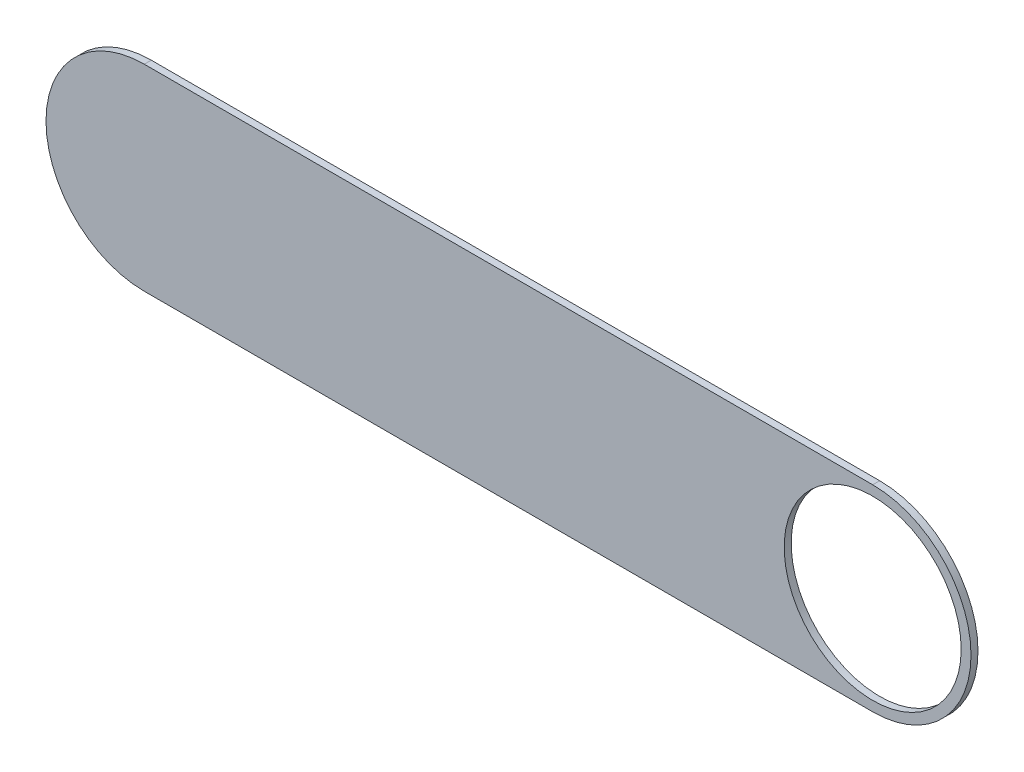
ISO-10303-21;
HEADER;
FILE_DESCRIPTION(('STEP AP214'),'2;1');
FILE_NAME('part.step','',(''),(''),'','','');
FILE_SCHEMA(('AUTOMOTIVE_DESIGN { 1 0 10303 214 1 1 1 1 }'));
ENDSEC;
DATA;
#1=APPLICATION_CONTEXT('core data for automotive mechanical design processes');
#2=APPLICATION_PROTOCOL_DEFINITION('international standard','automotive_design',2000,#1);
#3=PRODUCT_CONTEXT('',#1,'mechanical');
#4=PRODUCT('Part','Part','',(#3));
#5=PRODUCT_RELATED_PRODUCT_CATEGORY('part','',(#4));
#6=PRODUCT_DEFINITION_FORMATION('','',#4);
#7=PRODUCT_DEFINITION_CONTEXT('part definition',#1,'design');
#8=PRODUCT_DEFINITION('design','',#6,#7);
#9=PRODUCT_DEFINITION_SHAPE('','',#8);
#10=(LENGTH_UNIT() NAMED_UNIT(*) SI_UNIT(.MILLI.,.METRE.));
#11=(NAMED_UNIT(*) PLANE_ANGLE_UNIT() SI_UNIT($,.RADIAN.));
#12=(NAMED_UNIT(*) SI_UNIT($,.STERADIAN.) SOLID_ANGLE_UNIT());
#13=UNCERTAINTY_MEASURE_WITH_UNIT(LENGTH_MEASURE(1.E-05),#10,'distance_accuracy_value','');
#14=(GEOMETRIC_REPRESENTATION_CONTEXT(3) GLOBAL_UNCERTAINTY_ASSIGNED_CONTEXT((#13)) GLOBAL_UNIT_ASSIGNED_CONTEXT((#10,
#11,#12)) REPRESENTATION_CONTEXT('',''));
#15=CARTESIAN_POINT('',(0.,0.,0.));
#16=DIRECTION('',(0.,0.,1.));
#17=DIRECTION('',(1.,0.,0.));
#18=AXIS2_PLACEMENT_3D('',#15,#16,#17);
#19=CARTESIAN_POINT('',(113.4961916,51.9599926,0.));
#20=DIRECTION('',(0.,1.,0.));
#21=DIRECTION('',(1.,0.,0.));
#22=AXIS2_PLACEMENT_3D('',#19,#20,#21);
#23=PLANE('',#22);
#24=DIRECTION('',(1.,0.,0.));
#25=VECTOR('',#24,1.);
#26=CARTESIAN_POINT('',(113.4961916,51.9599926,0.03556));
#27=LINE('',#26,#25);
#28=CARTESIAN_POINT('',(113.4961916,51.9599926,0.03556));
#29=VERTEX_POINT('',#28);
#30=CARTESIAN_POINT('',(117.2000196,51.9599926,0.03556));
#31=VERTEX_POINT('',#30);
#32=EDGE_CURVE('E11',#29,#31,#27,.T.);
#33=ORIENTED_EDGE('',*,*,#32,.F.);
#34=DIRECTION('',(0.,0.,1.));
#35=VECTOR('',#34,1.);
#36=CARTESIAN_POINT('',(113.4961916,51.9599926,0.));
#37=LINE('',#36,#35);
#38=CARTESIAN_POINT('',(113.4961916,51.9599926,0.));
#39=VERTEX_POINT('',#38);
#40=EDGE_CURVE('E24',#39,#29,#37,.T.);
#41=ORIENTED_EDGE('',*,*,#40,.F.);
#42=DIRECTION('',(1.,0.,0.));
#43=VECTOR('',#42,1.);
#44=CARTESIAN_POINT('',(113.4961916,51.9599926,0.));
#45=LINE('',#44,#43);
#46=CARTESIAN_POINT('',(117.2000196,51.9599926,0.));
#47=VERTEX_POINT('',#46);
#48=EDGE_CURVE('E96',#39,#47,#45,.T.);
#49=ORIENTED_EDGE('',*,*,#48,.T.);
#50=DIRECTION('',(0.,0.,1.));
#51=VECTOR('',#50,1.);
#52=CARTESIAN_POINT('',(117.2000196,51.9599926,0.));
#53=LINE('',#52,#51);
#54=EDGE_CURVE('E37',#47,#31,#53,.T.);
#55=ORIENTED_EDGE('',*,*,#54,.T.);
#56=EDGE_LOOP('',(#33,#41,#49,#55));
#57=FACE_BOUND('',#56,.T.);
#58=ADVANCED_FACE('F17',(#57),#23,.F.);
#59=CARTESIAN_POINT('',(113.4961916,52.4599916,0.));
#60=DIRECTION('',(0.,0.,-1.));
#61=DIRECTION('',(0.,1.,0.));
#62=AXIS2_PLACEMENT_3D('',#59,#60,#61);
#63=CYLINDRICAL_SURFACE('',#62,0.499999);
#64=CARTESIAN_POINT('',(113.4961916,52.4599916,0.03556));
#65=DIRECTION('',(0.,0.,1.));
#66=DIRECTION('',(0.,1.,0.));
#67=AXIS2_PLACEMENT_3D('',#64,#65,#66);
#68=CIRCLE('',#67,0.499999);
#69=CARTESIAN_POINT('',(113.4961916,52.9599906,0.03556));
#70=VERTEX_POINT('',#69);
#71=EDGE_CURVE('E92',#70,#29,#68,.T.);
#72=ORIENTED_EDGE('',*,*,#71,.F.);
#73=DIRECTION('',(0.,0.,1.));
#74=VECTOR('',#73,1.);
#75=CARTESIAN_POINT('',(113.4961916,52.9599906,0.));
#76=LINE('',#75,#74);
#77=CARTESIAN_POINT('',(113.4961916,52.9599906,0.));
#78=VERTEX_POINT('',#77);
#79=EDGE_CURVE('E90',#78,#70,#76,.T.);
#80=ORIENTED_EDGE('',*,*,#79,.F.);
#81=CARTESIAN_POINT('',(113.4961916,52.4599916,0.));
#82=DIRECTION('',(0.,0.,1.));
#83=DIRECTION('',(0.,1.,0.));
#84=AXIS2_PLACEMENT_3D('',#81,#82,#83);
#85=CIRCLE('',#84,0.499999);
#86=EDGE_CURVE('E88',#78,#39,#85,.T.);
#87=ORIENTED_EDGE('',*,*,#86,.T.);
#88=ORIENTED_EDGE('',*,*,#40,.T.);
#89=EDGE_LOOP('',(#72,#80,#87,#88));
#90=FACE_BOUND('',#89,.T.);
#91=ADVANCED_FACE('F111',(#90),#63,.T.);
#92=CARTESIAN_POINT('',(117.2000196,52.4599916,0.));
#93=DIRECTION('',(0.,0.,-1.));
#94=DIRECTION('',(0.,-1.,0.));
#95=AXIS2_PLACEMENT_3D('',#92,#93,#94);
#96=CYLINDRICAL_SURFACE('',#95,0.499999);
#97=CARTESIAN_POINT('',(117.2000196,52.4599916,0.03556));
#98=DIRECTION('',(0.,0.,1.));
#99=DIRECTION('',(0.,-1.,0.));
#100=AXIS2_PLACEMENT_3D('',#97,#98,#99);
#101=CIRCLE('',#100,0.499999);
#102=CARTESIAN_POINT('',(117.2000196,52.9599906,0.03556));
#103=VERTEX_POINT('',#102);
#104=EDGE_CURVE('E85',#31,#103,#101,.T.);
#105=ORIENTED_EDGE('',*,*,#104,.F.);
#106=ORIENTED_EDGE('',*,*,#54,.F.);
#107=CARTESIAN_POINT('',(117.2000196,52.4599916,0.));
#108=DIRECTION('',(0.,0.,1.));
#109=DIRECTION('',(0.,-1.,0.));
#110=AXIS2_PLACEMENT_3D('',#107,#108,#109);
#111=CIRCLE('',#110,0.499999);
#112=CARTESIAN_POINT('',(117.2000196,52.9599906,0.));
#113=VERTEX_POINT('',#112);
#114=EDGE_CURVE('E82',#47,#113,#111,.T.);
#115=ORIENTED_EDGE('',*,*,#114,.T.);
#116=DIRECTION('',(0.,0.,1.));
#117=VECTOR('',#116,1.);
#118=CARTESIAN_POINT('',(117.2000196,52.9599906,0.));
#119=LINE('',#118,#117);
#120=EDGE_CURVE('E80',#113,#103,#119,.T.);
#121=ORIENTED_EDGE('',*,*,#120,.T.);
#122=EDGE_LOOP('',(#105,#106,#115,#121));
#123=FACE_BOUND('',#122,.T.);
#124=ADVANCED_FACE('F104',(#123),#96,.T.);
#125=CARTESIAN_POINT('',(117.2000196,52.9599906,0.));
#126=DIRECTION('',(0.,-1.,0.));
#127=DIRECTION('',(-1.,0.,0.));
#128=AXIS2_PLACEMENT_3D('',#125,#126,#127);
#129=PLANE('',#128);
#130=DIRECTION('',(-1.,0.,0.));
#131=VECTOR('',#130,1.);
#132=CARTESIAN_POINT('',(117.2000196,52.9599906,0.03556));
#133=LINE('',#132,#131);
#134=EDGE_CURVE('E77',#103,#70,#133,.T.);
#135=ORIENTED_EDGE('',*,*,#134,.F.);
#136=ORIENTED_EDGE('',*,*,#120,.F.);
#137=DIRECTION('',(-1.,0.,0.));
#138=VECTOR('',#137,1.);
#139=CARTESIAN_POINT('',(117.2000196,52.9599906,0.));
#140=LINE('',#139,#138);
#141=EDGE_CURVE('E68',#113,#78,#140,.T.);
#142=ORIENTED_EDGE('',*,*,#141,.T.);
#143=ORIENTED_EDGE('',*,*,#79,.T.);
#144=EDGE_LOOP('',(#135,#136,#142,#143));
#145=FACE_BOUND('',#144,.T.);
#146=ADVANCED_FACE('F110',(#145),#129,.F.);
#147=CARTESIAN_POINT('',(117.2000196,52.4599916,0.));
#148=DIRECTION('',(0.,0.,-1.));
#149=DIRECTION('',(1.,0.,0.));
#150=AXIS2_PLACEMENT_3D('',#147,#148,#149);
#151=CYLINDRICAL_SURFACE('',#150,0.4499991);
#152=DIRECTION('',(0.,0.,1.));
#153=VECTOR('',#152,1.);
#154=CARTESIAN_POINT('',(117.6500187,52.4599916,0.));
#155=LINE('',#154,#153);
#156=CARTESIAN_POINT('',(117.6500187,52.4599916,0.));
#157=VERTEX_POINT('',#156);
#158=CARTESIAN_POINT('',(117.6500187,52.4599916,0.03556));
#159=VERTEX_POINT('',#158);
#160=EDGE_CURVE('E62',#157,#159,#155,.T.);
#161=ORIENTED_EDGE('',*,*,#160,.T.);
#162=CARTESIAN_POINT('',(117.2000196,52.4599916,0.03556));
#163=DIRECTION('',(0.,0.,1.));
#164=DIRECTION('',(1.,0.,0.));
#165=AXIS2_PLACEMENT_3D('',#162,#163,#164);
#166=CIRCLE('',#165,0.4499991);
#167=EDGE_CURVE('E67',#159,#159,#166,.T.);
#168=ORIENTED_EDGE('',*,*,#167,.T.);
#169=ORIENTED_EDGE('',*,*,#160,.F.);
#170=CARTESIAN_POINT('',(117.2000196,52.4599916,0.));
#171=DIRECTION('',(0.,0.,1.));
#172=DIRECTION('',(1.,0.,0.));
#173=AXIS2_PLACEMENT_3D('',#170,#171,#172);
#174=CIRCLE('',#173,0.4499991);
#175=EDGE_CURVE('E65',#157,#157,#174,.T.);
#176=ORIENTED_EDGE('',*,*,#175,.F.);
#177=EDGE_LOOP('',(#161,#168,#169,#176));
#178=FACE_BOUND('',#177,.T.);
#179=ADVANCED_FACE('F64',(#178),#151,.F.);
#180=CARTESIAN_POINT('',(113.4961916,51.9599926,0.));
#181=DIRECTION('',(0.,0.,-1.));
#182=DIRECTION('',(-1.,0.,0.));
#183=AXIS2_PLACEMENT_3D('',#180,#181,#182);
#184=PLANE('',#183);
#185=ORIENTED_EDGE('',*,*,#48,.F.);
#186=ORIENTED_EDGE('',*,*,#86,.F.);
#187=ORIENTED_EDGE('',*,*,#141,.F.);
#188=ORIENTED_EDGE('',*,*,#114,.F.);
#189=EDGE_LOOP('',(#185,#186,#187,#188));
#190=FACE_BOUND('',#189,.T.);
#191=ORIENTED_EDGE('',*,*,#175,.T.);
#192=EDGE_LOOP('',(#191));
#193=FACE_BOUND('',#192,.T.);
#194=ADVANCED_FACE('F71',(#190,#193),#184,.T.);
#195=CARTESIAN_POINT('',(113.4961916,51.9599926,0.03556));
#196=DIRECTION('',(0.,0.,-1.));
#197=DIRECTION('',(-1.,0.,0.));
#198=AXIS2_PLACEMENT_3D('',#195,#196,#197);
#199=PLANE('',#198);
#200=ORIENTED_EDGE('',*,*,#134,.T.);
#201=ORIENTED_EDGE('',*,*,#71,.T.);
#202=ORIENTED_EDGE('',*,*,#32,.T.);
#203=ORIENTED_EDGE('',*,*,#104,.T.);
#204=EDGE_LOOP('',(#200,#201,#202,#203));
#205=FACE_BOUND('',#204,.T.);
#206=ORIENTED_EDGE('',*,*,#167,.F.);
#207=EDGE_LOOP('',(#206));
#208=FACE_BOUND('',#207,.T.);
#209=ADVANCED_FACE('F107',(#205,#208),#199,.F.);
#210=CLOSED_SHELL('',(#58,#91,#124,#146,#179,#194,#209));
#211=MANIFOLD_SOLID_BREP('B1',#210);
#212=ADVANCED_BREP_SHAPE_REPRESENTATION('',(#18,#211),#14);
#213=SHAPE_DEFINITION_REPRESENTATION(#9,#212);
ENDSEC;
END-ISO-10303-21;
